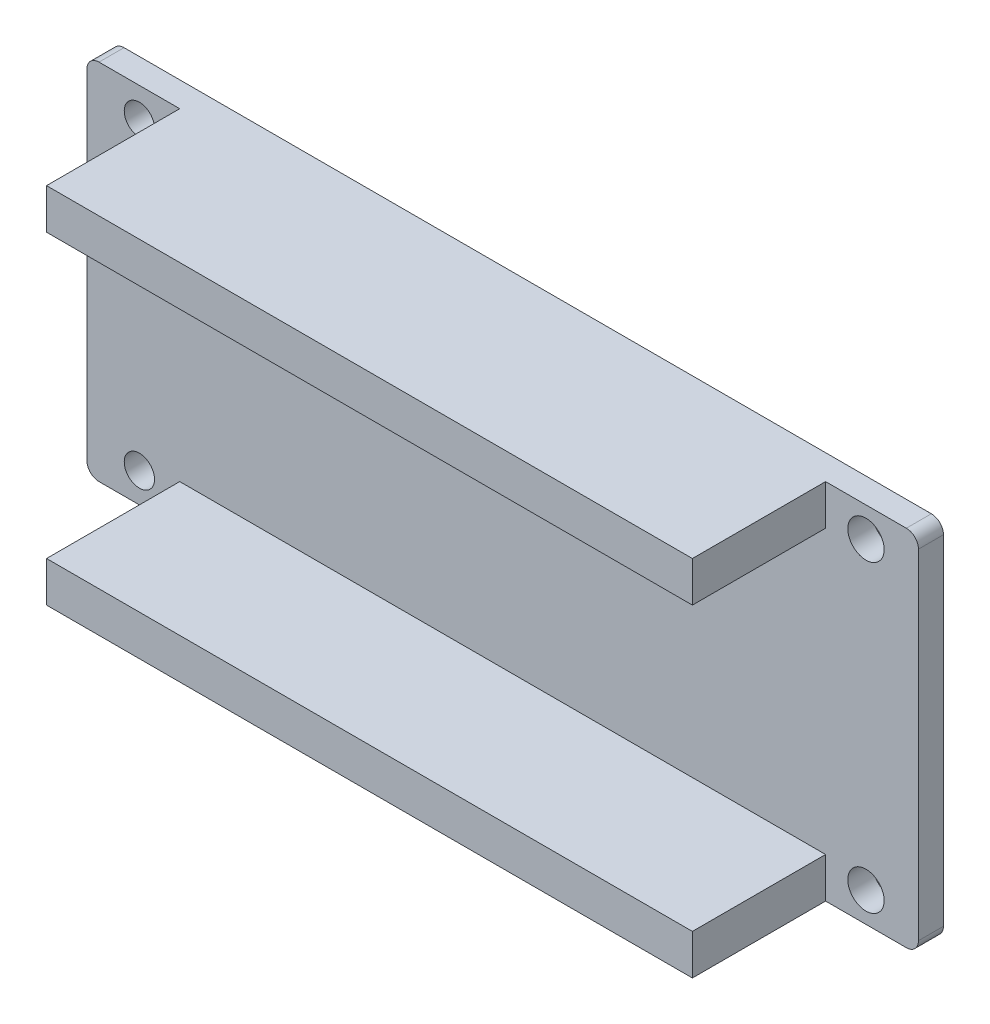
ISO-10303-21;
HEADER;
FILE_DESCRIPTION(('STEP AP214'),'2;1');
FILE_NAME('part.step','',(''),(''),'','','');
FILE_SCHEMA(('AUTOMOTIVE_DESIGN { 1 0 10303 214 1 1 1 1 }'));
ENDSEC;
DATA;
#1=APPLICATION_CONTEXT('core data for automotive mechanical design processes');
#2=APPLICATION_PROTOCOL_DEFINITION('international standard','automotive_design',2000,#1);
#3=PRODUCT_CONTEXT('',#1,'mechanical');
#4=PRODUCT('Part','Part','',(#3));
#5=PRODUCT_RELATED_PRODUCT_CATEGORY('part','',(#4));
#6=PRODUCT_DEFINITION_FORMATION('','',#4);
#7=PRODUCT_DEFINITION_CONTEXT('part definition',#1,'design');
#8=PRODUCT_DEFINITION('design','',#6,#7);
#9=PRODUCT_DEFINITION_SHAPE('','',#8);
#10=(LENGTH_UNIT() NAMED_UNIT(*) SI_UNIT(.MILLI.,.METRE.));
#11=(NAMED_UNIT(*) PLANE_ANGLE_UNIT() SI_UNIT($,.RADIAN.));
#12=(NAMED_UNIT(*) SI_UNIT($,.STERADIAN.) SOLID_ANGLE_UNIT());
#13=UNCERTAINTY_MEASURE_WITH_UNIT(LENGTH_MEASURE(1.E-05),#10,'distance_accuracy_value','');
#14=(GEOMETRIC_REPRESENTATION_CONTEXT(3) GLOBAL_UNCERTAINTY_ASSIGNED_CONTEXT((#13)) GLOBAL_UNIT_ASSIGNED_CONTEXT((#10,
#11,#12)) REPRESENTATION_CONTEXT('',''));
#15=CARTESIAN_POINT('',(0.,0.,0.));
#16=DIRECTION('',(0.,0.,1.));
#17=DIRECTION('',(1.,0.,0.));
#18=AXIS2_PLACEMENT_3D('',#15,#16,#17);
#19=CARTESIAN_POINT('',(0.,0.,1.5748));
#20=DIRECTION('',(0.,0.,-1.));
#21=DIRECTION('',(-1.,0.,0.));
#22=AXIS2_PLACEMENT_3D('',#19,#20,#21);
#23=PLANE('',#22);
#24=CARTESIAN_POINT('',(49.022,1.86689999999999,1.5748));
#25=DIRECTION('',(0.,0.,-1.));
#26=DIRECTION('',(-1.,0.,0.));
#27=AXIS2_PLACEMENT_3D('',#24,#25,#26);
#28=CIRCLE('',#27,1.143);
#29=CARTESIAN_POINT('',(47.879,1.86689999999999,1.5748));
#30=VERTEX_POINT('',#29);
#31=EDGE_CURVE('E470',#30,#30,#28,.F.);
#32=ORIENTED_EDGE('',*,*,#31,.F.);
#33=EDGE_LOOP('',(#32));
#34=FACE_BOUND('',#33,.T.);
#35=CARTESIAN_POINT('',(3.30200000000001,1.86689999999999,1.5748));
#36=DIRECTION('',(0.,0.,-1.));
#37=DIRECTION('',(-1.,0.,0.));
#38=AXIS2_PLACEMENT_3D('',#35,#36,#37);
#39=CIRCLE('',#38,0.9525);
#40=CARTESIAN_POINT('',(2.34950000000001,1.86689999999999,1.5748));
#41=VERTEX_POINT('',#40);
#42=EDGE_CURVE('E464',#41,#41,#39,.F.);
#43=ORIENTED_EDGE('',*,*,#42,.F.);
#44=EDGE_LOOP('',(#43));
#45=FACE_BOUND('',#44,.T.);
#46=CARTESIAN_POINT('',(3.30200000000001,20.9931,1.5748));
#47=DIRECTION('',(0.,0.,-1.));
#48=DIRECTION('',(-1.,0.,0.));
#49=AXIS2_PLACEMENT_3D('',#46,#47,#48);
#50=CIRCLE('',#49,0.9525);
#51=CARTESIAN_POINT('',(2.34950000000001,20.9931,1.5748));
#52=VERTEX_POINT('',#51);
#53=EDGE_CURVE('E452',#52,#52,#50,.F.);
#54=ORIENTED_EDGE('',*,*,#53,.F.);
#55=EDGE_LOOP('',(#54));
#56=FACE_BOUND('',#55,.T.);
#57=CARTESIAN_POINT('',(49.022,20.9931,1.5748));
#58=DIRECTION('',(0.,0.,-1.));
#59=DIRECTION('',(-1.,0.,0.));
#60=AXIS2_PLACEMENT_3D('',#57,#58,#59);
#61=CIRCLE('',#60,1.143);
#62=CARTESIAN_POINT('',(47.879,20.9931,1.5748));
#63=VERTEX_POINT('',#62);
#64=EDGE_CURVE('E207',#63,#63,#61,.F.);
#65=ORIENTED_EDGE('',*,*,#64,.F.);
#66=EDGE_LOOP('',(#65));
#67=FACE_BOUND('',#66,.T.);
#68=DIRECTION('',(0.,-1.,0.));
#69=VECTOR('',#68,1.);
#70=CARTESIAN_POINT('',(0.,0.,1.5748));
#71=LINE('',#70,#69);
#72=CARTESIAN_POINT('',(0.,22.098,1.5748));
#73=VERTEX_POINT('',#72);
#74=CARTESIAN_POINT('',(0.,0.762,1.5748));
#75=VERTEX_POINT('',#74);
#76=EDGE_CURVE('E187',#73,#75,#71,.T.);
#77=ORIENTED_EDGE('',*,*,#76,.T.);
#78=CARTESIAN_POINT('',(0.762,0.762,1.5748));
#79=DIRECTION('',(0.,0.,-1.));
#80=DIRECTION('',(-1.,0.,0.));
#81=AXIS2_PLACEMENT_3D('',#78,#79,#80);
#82=CIRCLE('',#81,0.762);
#83=CARTESIAN_POINT('',(0.762,0.,1.5748));
#84=VERTEX_POINT('',#83);
#85=EDGE_CURVE('E325',#75,#84,#82,.F.);
#86=ORIENTED_EDGE('',*,*,#85,.T.);
#87=DIRECTION('',(1.,0.,0.));
#88=VECTOR('',#87,1.);
#89=CARTESIAN_POINT('',(0.,0.,1.5748));
#90=LINE('',#89,#88);
#91=CARTESIAN_POINT('',(5.842,0.,1.5748));
#92=VERTEX_POINT('',#91);
#93=EDGE_CURVE('E186',#84,#92,#90,.T.);
#94=ORIENTED_EDGE('',*,*,#93,.T.);
#95=DIRECTION('',(0.,-1.,0.));
#96=VECTOR('',#95,1.);
#97=CARTESIAN_POINT('',(5.842,0.,1.5748));
#98=LINE('',#97,#96);
#99=CARTESIAN_POINT('',(5.842,2.54,1.5748));
#100=VERTEX_POINT('',#99);
#101=EDGE_CURVE('E197',#100,#92,#98,.T.);
#102=ORIENTED_EDGE('',*,*,#101,.F.);
#103=DIRECTION('',(-1.,0.,0.));
#104=VECTOR('',#103,1.);
#105=CARTESIAN_POINT('',(5.842,2.54,1.5748));
#106=LINE('',#105,#104);
#107=CARTESIAN_POINT('',(46.482,2.54,1.5748));
#108=VERTEX_POINT('',#107);
#109=EDGE_CURVE('E193',#108,#100,#106,.T.);
#110=ORIENTED_EDGE('',*,*,#109,.F.);
#111=DIRECTION('',(0.,1.,0.));
#112=VECTOR('',#111,1.);
#113=CARTESIAN_POINT('',(46.482,0.,1.5748));
#114=LINE('',#113,#112);
#115=CARTESIAN_POINT('',(46.482,0.,1.5748));
#116=VERTEX_POINT('',#115);
#117=EDGE_CURVE('E190',#116,#108,#114,.T.);
#118=ORIENTED_EDGE('',*,*,#117,.F.);
#119=CARTESIAN_POINT('',(51.562,0.,1.5748));
#120=VERTEX_POINT('',#119);
#121=EDGE_CURVE('E175',#116,#120,#90,.T.);
#122=ORIENTED_EDGE('',*,*,#121,.T.);
#123=CARTESIAN_POINT('',(51.562,0.762,1.5748));
#124=DIRECTION('',(0.,0.,-1.));
#125=DIRECTION('',(-1.,0.,0.));
#126=AXIS2_PLACEMENT_3D('',#123,#124,#125);
#127=CIRCLE('',#126,0.762);
#128=CARTESIAN_POINT('',(52.324,0.762,1.5748));
#129=VERTEX_POINT('',#128);
#130=EDGE_CURVE('E323',#120,#129,#127,.F.);
#131=ORIENTED_EDGE('',*,*,#130,.T.);
#132=DIRECTION('',(0.,1.,0.));
#133=VECTOR('',#132,1.);
#134=CARTESIAN_POINT('',(52.324,0.,1.5748));
#135=LINE('',#134,#133);
#136=CARTESIAN_POINT('',(52.324,22.098,1.5748));
#137=VERTEX_POINT('',#136);
#138=EDGE_CURVE('E290',#129,#137,#135,.T.);
#139=ORIENTED_EDGE('',*,*,#138,.T.);
#140=CARTESIAN_POINT('',(51.562,22.098,1.5748));
#141=DIRECTION('',(0.,0.,-1.));
#142=DIRECTION('',(-1.,0.,0.));
#143=AXIS2_PLACEMENT_3D('',#140,#141,#142);
#144=CIRCLE('',#143,0.762);
#145=CARTESIAN_POINT('',(51.562,22.86,1.5748));
#146=VERTEX_POINT('',#145);
#147=EDGE_CURVE('E58',#137,#146,#144,.F.);
#148=ORIENTED_EDGE('',*,*,#147,.T.);
#149=DIRECTION('',(-1.,0.,0.));
#150=VECTOR('',#149,1.);
#151=CARTESIAN_POINT('',(0.,22.86,1.5748));
#152=LINE('',#151,#150);
#153=CARTESIAN_POINT('',(46.482,22.86,1.5748));
#154=VERTEX_POINT('',#153);
#155=EDGE_CURVE('E293',#146,#154,#152,.T.);
#156=ORIENTED_EDGE('',*,*,#155,.T.);
#157=DIRECTION('',(0.,1.,0.));
#158=VECTOR('',#157,1.);
#159=CARTESIAN_POINT('',(46.482,22.86,1.5748));
#160=LINE('',#159,#158);
#161=CARTESIAN_POINT('',(46.482,20.32,1.5748));
#162=VERTEX_POINT('',#161);
#163=EDGE_CURVE('E229',#162,#154,#160,.T.);
#164=ORIENTED_EDGE('',*,*,#163,.F.);
#165=DIRECTION('',(1.,0.,0.));
#166=VECTOR('',#165,1.);
#167=CARTESIAN_POINT('',(5.842,20.32,1.5748));
#168=LINE('',#167,#166);
#169=CARTESIAN_POINT('',(5.842,20.32,1.5748));
#170=VERTEX_POINT('',#169);
#171=EDGE_CURVE('E238',#170,#162,#168,.T.);
#172=ORIENTED_EDGE('',*,*,#171,.F.);
#173=DIRECTION('',(0.,-1.,0.));
#174=VECTOR('',#173,1.);
#175=CARTESIAN_POINT('',(5.842,22.86,1.5748));
#176=LINE('',#175,#174);
#177=CARTESIAN_POINT('',(5.842,22.86,1.5748));
#178=VERTEX_POINT('',#177);
#179=EDGE_CURVE('E218',#178,#170,#176,.T.);
#180=ORIENTED_EDGE('',*,*,#179,.F.);
#181=CARTESIAN_POINT('',(0.762,22.86,1.5748));
#182=VERTEX_POINT('',#181);
#183=EDGE_CURVE('E292',#178,#182,#152,.T.);
#184=ORIENTED_EDGE('',*,*,#183,.T.);
#185=CARTESIAN_POINT('',(0.762,22.098,1.5748));
#186=DIRECTION('',(0.,0.,-1.));
#187=DIRECTION('',(-1.,0.,0.));
#188=AXIS2_PLACEMENT_3D('',#185,#186,#187);
#189=CIRCLE('',#188,0.762);
#190=EDGE_CURVE('E320',#182,#73,#189,.F.);
#191=ORIENTED_EDGE('',*,*,#190,.T.);
#192=EDGE_LOOP('',(#77,#86,#94,#102,#110,#118,#122,#131,#139,#148,#156,#164,#172,#180,#184,#191));
#193=FACE_BOUND('',#192,.T.);
#194=ADVANCED_FACE('F36',(#34,#45,#56,#67,#193),#23,.F.);
#195=CARTESIAN_POINT('',(0.,0.,1.5748));
#196=DIRECTION('',(1.,0.,0.));
#197=DIRECTION('',(0.,0.,-1.));
#198=AXIS2_PLACEMENT_3D('',#195,#196,#197);
#199=PLANE('',#198);
#200=DIRECTION('',(0.,-1.,0.));
#201=VECTOR('',#200,1.);
#202=CARTESIAN_POINT('',(0.,0.,0.));
#203=LINE('',#202,#201);
#204=CARTESIAN_POINT('',(0.,22.098,0.));
#205=VERTEX_POINT('',#204);
#206=CARTESIAN_POINT('',(0.,0.762,0.));
#207=VERTEX_POINT('',#206);
#208=EDGE_CURVE('E287',#205,#207,#203,.T.);
#209=ORIENTED_EDGE('',*,*,#208,.T.);
#210=DIRECTION('',(0.,0.,-1.));
#211=VECTOR('',#210,1.);
#212=CARTESIAN_POINT('',(0.,0.762,1.5748));
#213=LINE('',#212,#211);
#214=EDGE_CURVE('E318',#207,#75,#213,.F.);
#215=ORIENTED_EDGE('',*,*,#214,.T.);
#216=ORIENTED_EDGE('',*,*,#76,.F.);
#217=DIRECTION('',(0.,0.,-1.));
#218=VECTOR('',#217,1.);
#219=CARTESIAN_POINT('',(0.,22.098,1.5748));
#220=LINE('',#219,#218);
#221=EDGE_CURVE('E315',#73,#205,#220,.T.);
#222=ORIENTED_EDGE('',*,*,#221,.T.);
#223=EDGE_LOOP('',(#209,#215,#216,#222));
#224=FACE_BOUND('',#223,.T.);
#225=ADVANCED_FACE('F374',(#224),#199,.F.);
#226=CARTESIAN_POINT('',(0.,0.,1.5748));
#227=DIRECTION('',(0.,1.,0.));
#228=DIRECTION('',(0.,0.,1.));
#229=AXIS2_PLACEMENT_3D('',#226,#227,#228);
#230=PLANE('',#229);
#231=ORIENTED_EDGE('',*,*,#93,.F.);
#232=DIRECTION('',(0.,0.,-1.));
#233=VECTOR('',#232,1.);
#234=CARTESIAN_POINT('',(0.762,0.,1.5748));
#235=LINE('',#234,#233);
#236=CARTESIAN_POINT('',(0.762,0.,0.));
#237=VERTEX_POINT('',#236);
#238=EDGE_CURVE('E304',#84,#237,#235,.T.);
#239=ORIENTED_EDGE('',*,*,#238,.T.);
#240=DIRECTION('',(1.,0.,0.));
#241=VECTOR('',#240,1.);
#242=CARTESIAN_POINT('',(0.,0.,0.));
#243=LINE('',#242,#241);
#244=CARTESIAN_POINT('',(51.562,0.,0.));
#245=VERTEX_POINT('',#244);
#246=EDGE_CURVE('E297',#237,#245,#243,.T.);
#247=ORIENTED_EDGE('',*,*,#246,.T.);
#248=DIRECTION('',(0.,0.,-1.));
#249=VECTOR('',#248,1.);
#250=CARTESIAN_POINT('',(51.562,0.,1.5748));
#251=LINE('',#250,#249);
#252=EDGE_CURVE('E184',#245,#120,#251,.F.);
#253=ORIENTED_EDGE('',*,*,#252,.T.);
#254=ORIENTED_EDGE('',*,*,#121,.F.);
#255=DIRECTION('',(0.,0.,-1.));
#256=VECTOR('',#255,1.);
#257=CARTESIAN_POINT('',(46.482,0.,9.9568));
#258=LINE('',#257,#256);
#259=CARTESIAN_POINT('',(46.482,0.,9.9568));
#260=VERTEX_POINT('',#259);
#261=EDGE_CURVE('E180',#260,#116,#258,.T.);
#262=ORIENTED_EDGE('',*,*,#261,.F.);
#263=DIRECTION('',(1.,0.,0.));
#264=VECTOR('',#263,1.);
#265=CARTESIAN_POINT('',(5.842,0.,9.9568));
#266=LINE('',#265,#264);
#267=CARTESIAN_POINT('',(5.842,0.,9.9568));
#268=VERTEX_POINT('',#267);
#269=EDGE_CURVE('E221',#268,#260,#266,.T.);
#270=ORIENTED_EDGE('',*,*,#269,.F.);
#271=DIRECTION('',(0.,0.,-1.));
#272=VECTOR('',#271,1.);
#273=CARTESIAN_POINT('',(5.842,0.,9.9568));
#274=LINE('',#273,#272);
#275=EDGE_CURVE('E202',#268,#92,#274,.T.);
#276=ORIENTED_EDGE('',*,*,#275,.T.);
#277=EDGE_LOOP('',(#231,#239,#247,#253,#254,#262,#270,#276));
#278=FACE_BOUND('',#277,.T.);
#279=ADVANCED_FACE('F178',(#278),#230,.F.);
#280=CARTESIAN_POINT('',(52.324,0.,1.5748));
#281=DIRECTION('',(-1.,0.,0.));
#282=DIRECTION('',(0.,0.,1.));
#283=AXIS2_PLACEMENT_3D('',#280,#281,#282);
#284=PLANE('',#283);
#285=ORIENTED_EDGE('',*,*,#138,.F.);
#286=DIRECTION('',(0.,0.,-1.));
#287=VECTOR('',#286,1.);
#288=CARTESIAN_POINT('',(52.324,0.762,1.5748));
#289=LINE('',#288,#287);
#290=CARTESIAN_POINT('',(52.324,0.762,0.));
#291=VERTEX_POINT('',#290);
#292=EDGE_CURVE('E329',#129,#291,#289,.T.);
#293=ORIENTED_EDGE('',*,*,#292,.T.);
#294=DIRECTION('',(0.,1.,0.));
#295=VECTOR('',#294,1.);
#296=CARTESIAN_POINT('',(52.324,0.,0.));
#297=LINE('',#296,#295);
#298=CARTESIAN_POINT('',(52.324,22.098,0.));
#299=VERTEX_POINT('',#298);
#300=EDGE_CURVE('E299',#291,#299,#297,.T.);
#301=ORIENTED_EDGE('',*,*,#300,.T.);
#302=DIRECTION('',(0.,0.,-1.));
#303=VECTOR('',#302,1.);
#304=CARTESIAN_POINT('',(52.324,22.098,1.5748));
#305=LINE('',#304,#303);
#306=EDGE_CURVE('E327',#299,#137,#305,.F.);
#307=ORIENTED_EDGE('',*,*,#306,.T.);
#308=EDGE_LOOP('',(#285,#293,#301,#307));
#309=FACE_BOUND('',#308,.T.);
#310=ADVANCED_FACE('F335',(#309),#284,.F.);
#311=CARTESIAN_POINT('',(0.,22.86,1.5748));
#312=DIRECTION('',(0.,-1.,0.));
#313=DIRECTION('',(0.,0.,-1.));
#314=AXIS2_PLACEMENT_3D('',#311,#312,#313);
#315=PLANE('',#314);
#316=ORIENTED_EDGE('',*,*,#155,.F.);
#317=DIRECTION('',(0.,0.,-1.));
#318=VECTOR('',#317,1.);
#319=CARTESIAN_POINT('',(51.562,22.86,1.5748));
#320=LINE('',#319,#318);
#321=CARTESIAN_POINT('',(51.562,22.86,0.));
#322=VERTEX_POINT('',#321);
#323=EDGE_CURVE('E11',#146,#322,#320,.T.);
#324=ORIENTED_EDGE('',*,*,#323,.T.);
#325=DIRECTION('',(-1.,0.,0.));
#326=VECTOR('',#325,1.);
#327=CARTESIAN_POINT('',(0.,22.86,0.));
#328=LINE('',#327,#326);
#329=CARTESIAN_POINT('',(0.762,22.86,0.));
#330=VERTEX_POINT('',#329);
#331=EDGE_CURVE('E288',#322,#330,#328,.T.);
#332=ORIENTED_EDGE('',*,*,#331,.T.);
#333=DIRECTION('',(0.,0.,-1.));
#334=VECTOR('',#333,1.);
#335=CARTESIAN_POINT('',(0.762,22.86,1.5748));
#336=LINE('',#335,#334);
#337=EDGE_CURVE('E44',#330,#182,#336,.F.);
#338=ORIENTED_EDGE('',*,*,#337,.T.);
#339=ORIENTED_EDGE('',*,*,#183,.F.);
#340=DIRECTION('',(0.,0.,-1.));
#341=VECTOR('',#340,1.);
#342=CARTESIAN_POINT('',(5.842,22.86,9.9568));
#343=LINE('',#342,#341);
#344=CARTESIAN_POINT('',(5.842,22.86,9.9568));
#345=VERTEX_POINT('',#344);
#346=EDGE_CURVE('E235',#345,#178,#343,.T.);
#347=ORIENTED_EDGE('',*,*,#346,.F.);
#348=DIRECTION('',(-1.,0.,0.));
#349=VECTOR('',#348,1.);
#350=CARTESIAN_POINT('',(5.842,22.86,9.9568));
#351=LINE('',#350,#349);
#352=CARTESIAN_POINT('',(46.482,22.86,9.9568));
#353=VERTEX_POINT('',#352);
#354=EDGE_CURVE('E233',#353,#345,#351,.T.);
#355=ORIENTED_EDGE('',*,*,#354,.F.);
#356=DIRECTION('',(0.,0.,-1.));
#357=VECTOR('',#356,1.);
#358=CARTESIAN_POINT('',(46.482,22.86,9.9568));
#359=LINE('',#358,#357);
#360=EDGE_CURVE('E245',#353,#154,#359,.T.);
#361=ORIENTED_EDGE('',*,*,#360,.T.);
#362=EDGE_LOOP('',(#316,#324,#332,#338,#339,#347,#355,#361));
#363=FACE_BOUND('',#362,.T.);
#364=ADVANCED_FACE('F345',(#363),#315,.F.);
#365=CARTESIAN_POINT('',(0.,0.,0.));
#366=DIRECTION('',(0.,0.,-1.));
#367=DIRECTION('',(-1.,0.,0.));
#368=AXIS2_PLACEMENT_3D('',#365,#366,#367);
#369=PLANE('',#368);
#370=CARTESIAN_POINT('',(49.022,1.86689999999999,0.));
#371=DIRECTION('',(0.,0.,-1.));
#372=DIRECTION('',(1.,0.,0.));
#373=AXIS2_PLACEMENT_3D('',#370,#371,#372);
#374=CIRCLE('',#373,1.143);
#375=CARTESIAN_POINT('',(50.165,1.86689999999999,0.));
#376=VERTEX_POINT('',#375);
#377=EDGE_CURVE('E467',#376,#376,#374,.T.);
#378=ORIENTED_EDGE('',*,*,#377,.F.);
#379=EDGE_LOOP('',(#378));
#380=FACE_BOUND('',#379,.T.);
#381=CARTESIAN_POINT('',(3.30200000000001,1.86689999999999,0.));
#382=DIRECTION('',(0.,0.,-1.));
#383=DIRECTION('',(1.,0.,0.));
#384=AXIS2_PLACEMENT_3D('',#381,#382,#383);
#385=CIRCLE('',#384,0.9525);
#386=CARTESIAN_POINT('',(4.25450000000001,1.86689999999999,0.));
#387=VERTEX_POINT('',#386);
#388=EDGE_CURVE('E461',#387,#387,#385,.T.);
#389=ORIENTED_EDGE('',*,*,#388,.F.);
#390=EDGE_LOOP('',(#389));
#391=FACE_BOUND('',#390,.T.);
#392=CARTESIAN_POINT('',(3.30200000000001,20.9931,0.));
#393=DIRECTION('',(0.,0.,-1.));
#394=DIRECTION('',(-1.,0.,0.));
#395=AXIS2_PLACEMENT_3D('',#392,#393,#394);
#396=CIRCLE('',#395,0.9525);
#397=CARTESIAN_POINT('',(2.34950000000001,20.9931,0.));
#398=VERTEX_POINT('',#397);
#399=EDGE_CURVE('E455',#398,#398,#396,.T.);
#400=ORIENTED_EDGE('',*,*,#399,.F.);
#401=EDGE_LOOP('',(#400));
#402=FACE_BOUND('',#401,.T.);
#403=CARTESIAN_POINT('',(49.022,20.9931,0.));
#404=DIRECTION('',(0.,0.,-1.));
#405=DIRECTION('',(-1.,0.,0.));
#406=AXIS2_PLACEMENT_3D('',#403,#404,#405);
#407=CIRCLE('',#406,1.143);
#408=CARTESIAN_POINT('',(47.879,20.9931,0.));
#409=VERTEX_POINT('',#408);
#410=EDGE_CURVE('E457',#409,#409,#407,.T.);
#411=ORIENTED_EDGE('',*,*,#410,.F.);
#412=EDGE_LOOP('',(#411));
#413=FACE_BOUND('',#412,.T.);
#414=DIRECTION('',(0.,1.,0.));
#415=VECTOR('',#414,1.);
#416=CARTESIAN_POINT('',(12.7,2.54,0.));
#417=LINE('',#416,#415);
#418=CARTESIAN_POINT('',(12.7,2.54,0.));
#419=VERTEX_POINT('',#418);
#420=CARTESIAN_POINT('',(12.7,20.32,0.));
#421=VERTEX_POINT('',#420);
#422=EDGE_CURVE('E254',#419,#421,#417,.T.);
#423=ORIENTED_EDGE('',*,*,#422,.F.);
#424=DIRECTION('',(-1.,0.,0.));
#425=VECTOR('',#424,1.);
#426=CARTESIAN_POINT('',(43.688,2.54,0.));
#427=LINE('',#426,#425);
#428=CARTESIAN_POINT('',(43.688,2.54,0.));
#429=VERTEX_POINT('',#428);
#430=EDGE_CURVE('E259',#429,#419,#427,.T.);
#431=ORIENTED_EDGE('',*,*,#430,.F.);
#432=DIRECTION('',(0.,-1.,0.));
#433=VECTOR('',#432,1.);
#434=CARTESIAN_POINT('',(43.688,2.54,0.));
#435=LINE('',#434,#433);
#436=CARTESIAN_POINT('',(43.688,20.32,0.));
#437=VERTEX_POINT('',#436);
#438=EDGE_CURVE('E271',#437,#429,#435,.T.);
#439=ORIENTED_EDGE('',*,*,#438,.F.);
#440=DIRECTION('',(1.,0.,0.));
#441=VECTOR('',#440,1.);
#442=CARTESIAN_POINT('',(43.688,20.32,0.));
#443=LINE('',#442,#441);
#444=EDGE_CURVE('E268',#421,#437,#443,.T.);
#445=ORIENTED_EDGE('',*,*,#444,.F.);
#446=EDGE_LOOP('',(#423,#431,#439,#445));
#447=FACE_BOUND('',#446,.T.);
#448=ORIENTED_EDGE('',*,*,#246,.F.);
#449=CARTESIAN_POINT('',(0.762,0.762,0.));
#450=DIRECTION('',(0.,0.,-1.));
#451=DIRECTION('',(-1.,0.,0.));
#452=AXIS2_PLACEMENT_3D('',#449,#450,#451);
#453=CIRCLE('',#452,0.762);
#454=EDGE_CURVE('E313',#237,#207,#453,.T.);
#455=ORIENTED_EDGE('',*,*,#454,.T.);
#456=ORIENTED_EDGE('',*,*,#208,.F.);
#457=CARTESIAN_POINT('',(0.762,22.098,0.));
#458=DIRECTION('',(0.,0.,-1.));
#459=DIRECTION('',(-1.,0.,0.));
#460=AXIS2_PLACEMENT_3D('',#457,#458,#459);
#461=CIRCLE('',#460,0.762);
#462=EDGE_CURVE('E307',#205,#330,#461,.T.);
#463=ORIENTED_EDGE('',*,*,#462,.T.);
#464=ORIENTED_EDGE('',*,*,#331,.F.);
#465=CARTESIAN_POINT('',(51.562,22.098,0.));
#466=DIRECTION('',(0.,0.,-1.));
#467=DIRECTION('',(-1.,0.,0.));
#468=AXIS2_PLACEMENT_3D('',#465,#466,#467);
#469=CIRCLE('',#468,0.762);
#470=EDGE_CURVE('E309',#322,#299,#469,.T.);
#471=ORIENTED_EDGE('',*,*,#470,.T.);
#472=ORIENTED_EDGE('',*,*,#300,.F.);
#473=CARTESIAN_POINT('',(51.562,0.762,0.));
#474=DIRECTION('',(0.,0.,-1.));
#475=DIRECTION('',(-1.,0.,0.));
#476=AXIS2_PLACEMENT_3D('',#473,#474,#475);
#477=CIRCLE('',#476,0.762);
#478=EDGE_CURVE('E311',#291,#245,#477,.T.);
#479=ORIENTED_EDGE('',*,*,#478,.T.);
#480=EDGE_LOOP('',(#448,#455,#456,#463,#464,#471,#472,#479));
#481=FACE_BOUND('',#480,.T.);
#482=ADVANCED_FACE('F340',(#380,#391,#402,#413,#447,#481),#369,.T.);
#483=CARTESIAN_POINT('',(12.7,2.54,-2.032));
#484=DIRECTION('',(1.,0.,0.));
#485=DIRECTION('',(0.,0.,-1.));
#486=AXIS2_PLACEMENT_3D('',#483,#484,#485);
#487=PLANE('',#486);
#488=ORIENTED_EDGE('',*,*,#422,.T.);
#489=DIRECTION('',(0.,0.,1.));
#490=VECTOR('',#489,1.);
#491=CARTESIAN_POINT('',(12.7,20.32,-2.032));
#492=LINE('',#491,#490);
#493=CARTESIAN_POINT('',(12.7,20.32,-2.032));
#494=VERTEX_POINT('',#493);
#495=EDGE_CURVE('E284',#494,#421,#492,.T.);
#496=ORIENTED_EDGE('',*,*,#495,.F.);
#497=DIRECTION('',(0.,1.,0.));
#498=VECTOR('',#497,1.);
#499=CARTESIAN_POINT('',(12.7,2.54,-2.032));
#500=LINE('',#499,#498);
#501=CARTESIAN_POINT('',(12.7,2.54,-2.032));
#502=VERTEX_POINT('',#501);
#503=EDGE_CURVE('E255',#502,#494,#500,.T.);
#504=ORIENTED_EDGE('',*,*,#503,.F.);
#505=DIRECTION('',(0.,0.,1.));
#506=VECTOR('',#505,1.);
#507=CARTESIAN_POINT('',(12.7,2.54,-2.032));
#508=LINE('',#507,#506);
#509=EDGE_CURVE('E265',#502,#419,#508,.T.);
#510=ORIENTED_EDGE('',*,*,#509,.T.);
#511=EDGE_LOOP('',(#488,#496,#504,#510));
#512=FACE_BOUND('',#511,.T.);
#513=ADVANCED_FACE('F388',(#512),#487,.F.);
#514=CARTESIAN_POINT('',(43.688,20.32,-2.032));
#515=DIRECTION('',(0.,-1.,0.));
#516=DIRECTION('',(0.,0.,-1.));
#517=AXIS2_PLACEMENT_3D('',#514,#515,#516);
#518=PLANE('',#517);
#519=ORIENTED_EDGE('',*,*,#444,.T.);
#520=DIRECTION('',(0.,0.,1.));
#521=VECTOR('',#520,1.);
#522=CARTESIAN_POINT('',(43.688,20.32,-2.032));
#523=LINE('',#522,#521);
#524=CARTESIAN_POINT('',(43.688,20.32,-2.032));
#525=VERTEX_POINT('',#524);
#526=EDGE_CURVE('E281',#525,#437,#523,.T.);
#527=ORIENTED_EDGE('',*,*,#526,.F.);
#528=DIRECTION('',(1.,0.,0.));
#529=VECTOR('',#528,1.);
#530=CARTESIAN_POINT('',(43.688,20.32,-2.032));
#531=LINE('',#530,#529);
#532=EDGE_CURVE('E258',#494,#525,#531,.T.);
#533=ORIENTED_EDGE('',*,*,#532,.F.);
#534=ORIENTED_EDGE('',*,*,#495,.T.);
#535=EDGE_LOOP('',(#519,#527,#533,#534));
#536=FACE_BOUND('',#535,.T.);
#537=ADVANCED_FACE('F496',(#536),#518,.F.);
#538=CARTESIAN_POINT('',(43.688,2.54,-2.032));
#539=DIRECTION('',(-1.,0.,0.));
#540=DIRECTION('',(0.,0.,1.));
#541=AXIS2_PLACEMENT_3D('',#538,#539,#540);
#542=PLANE('',#541);
#543=ORIENTED_EDGE('',*,*,#438,.T.);
#544=DIRECTION('',(0.,0.,1.));
#545=VECTOR('',#544,1.);
#546=CARTESIAN_POINT('',(43.688,2.54,-2.032));
#547=LINE('',#546,#545);
#548=CARTESIAN_POINT('',(43.688,2.54,-2.032));
#549=VERTEX_POINT('',#548);
#550=EDGE_CURVE('E278',#549,#429,#547,.T.);
#551=ORIENTED_EDGE('',*,*,#550,.F.);
#552=DIRECTION('',(0.,-1.,0.));
#553=VECTOR('',#552,1.);
#554=CARTESIAN_POINT('',(43.688,2.54,-2.032));
#555=LINE('',#554,#553);
#556=EDGE_CURVE('E261',#525,#549,#555,.T.);
#557=ORIENTED_EDGE('',*,*,#556,.F.);
#558=ORIENTED_EDGE('',*,*,#526,.T.);
#559=EDGE_LOOP('',(#543,#551,#557,#558));
#560=FACE_BOUND('',#559,.T.);
#561=ADVANCED_FACE('F494',(#560),#542,.F.);
#562=CARTESIAN_POINT('',(43.688,2.54,-2.032));
#563=DIRECTION('',(0.,1.,0.));
#564=DIRECTION('',(0.,0.,1.));
#565=AXIS2_PLACEMENT_3D('',#562,#563,#564);
#566=PLANE('',#565);
#567=ORIENTED_EDGE('',*,*,#430,.T.);
#568=ORIENTED_EDGE('',*,*,#509,.F.);
#569=DIRECTION('',(-1.,0.,0.));
#570=VECTOR('',#569,1.);
#571=CARTESIAN_POINT('',(43.688,2.54,-2.032));
#572=LINE('',#571,#570);
#573=EDGE_CURVE('E263',#549,#502,#572,.T.);
#574=ORIENTED_EDGE('',*,*,#573,.F.);
#575=ORIENTED_EDGE('',*,*,#550,.T.);
#576=EDGE_LOOP('',(#567,#568,#574,#575));
#577=FACE_BOUND('',#576,.T.);
#578=ADVANCED_FACE('F485',(#577),#566,.F.);
#579=CARTESIAN_POINT('',(0.,0.,-2.032));
#580=DIRECTION('',(0.,0.,1.));
#581=DIRECTION('',(1.,0.,0.));
#582=AXIS2_PLACEMENT_3D('',#579,#580,#581);
#583=PLANE('',#582);
#584=ORIENTED_EDGE('',*,*,#503,.T.);
#585=ORIENTED_EDGE('',*,*,#532,.T.);
#586=ORIENTED_EDGE('',*,*,#556,.T.);
#587=ORIENTED_EDGE('',*,*,#573,.T.);
#588=EDGE_LOOP('',(#584,#585,#586,#587));
#589=FACE_BOUND('',#588,.T.);
#590=ADVANCED_FACE('F490',(#589),#583,.F.);
#591=CARTESIAN_POINT('',(5.842,22.86,9.9568));
#592=DIRECTION('',(1.,0.,0.));
#593=DIRECTION('',(0.,0.,-1.));
#594=AXIS2_PLACEMENT_3D('',#591,#592,#593);
#595=PLANE('',#594);
#596=ORIENTED_EDGE('',*,*,#179,.T.);
#597=DIRECTION('',(0.,0.,-1.));
#598=VECTOR('',#597,1.);
#599=CARTESIAN_POINT('',(5.842,20.32,9.9568));
#600=LINE('',#599,#598);
#601=CARTESIAN_POINT('',(5.842,20.32,9.9568));
#602=VERTEX_POINT('',#601);
#603=EDGE_CURVE('E251',#602,#170,#600,.T.);
#604=ORIENTED_EDGE('',*,*,#603,.F.);
#605=DIRECTION('',(0.,-1.,0.));
#606=VECTOR('',#605,1.);
#607=CARTESIAN_POINT('',(5.842,22.86,9.9568));
#608=LINE('',#607,#606);
#609=EDGE_CURVE('E225',#345,#602,#608,.T.);
#610=ORIENTED_EDGE('',*,*,#609,.F.);
#611=ORIENTED_EDGE('',*,*,#346,.T.);
#612=EDGE_LOOP('',(#596,#604,#610,#611));
#613=FACE_BOUND('',#612,.T.);
#614=ADVANCED_FACE('F359',(#613),#595,.F.);
#615=CARTESIAN_POINT('',(5.842,20.32,9.9568));
#616=DIRECTION('',(0.,1.,0.));
#617=DIRECTION('',(0.,0.,1.));
#618=AXIS2_PLACEMENT_3D('',#615,#616,#617);
#619=PLANE('',#618);
#620=ORIENTED_EDGE('',*,*,#171,.T.);
#621=DIRECTION('',(0.,0.,-1.));
#622=VECTOR('',#621,1.);
#623=CARTESIAN_POINT('',(46.482,20.32,9.9568));
#624=LINE('',#623,#622);
#625=CARTESIAN_POINT('',(46.482,20.32,9.9568));
#626=VERTEX_POINT('',#625);
#627=EDGE_CURVE('E248',#626,#162,#624,.T.);
#628=ORIENTED_EDGE('',*,*,#627,.F.);
#629=DIRECTION('',(1.,0.,0.));
#630=VECTOR('',#629,1.);
#631=CARTESIAN_POINT('',(5.842,20.32,9.9568));
#632=LINE('',#631,#630);
#633=EDGE_CURVE('E228',#602,#626,#632,.T.);
#634=ORIENTED_EDGE('',*,*,#633,.F.);
#635=ORIENTED_EDGE('',*,*,#603,.T.);
#636=EDGE_LOOP('',(#620,#628,#634,#635));
#637=FACE_BOUND('',#636,.T.);
#638=ADVANCED_FACE('F353',(#637),#619,.F.);
#639=CARTESIAN_POINT('',(46.482,22.86,9.9568));
#640=DIRECTION('',(-1.,0.,0.));
#641=DIRECTION('',(0.,0.,1.));
#642=AXIS2_PLACEMENT_3D('',#639,#640,#641);
#643=PLANE('',#642);
#644=ORIENTED_EDGE('',*,*,#163,.T.);
#645=ORIENTED_EDGE('',*,*,#360,.F.);
#646=DIRECTION('',(0.,1.,0.));
#647=VECTOR('',#646,1.);
#648=CARTESIAN_POINT('',(46.482,22.86,9.9568));
#649=LINE('',#648,#647);
#650=EDGE_CURVE('E231',#626,#353,#649,.T.);
#651=ORIENTED_EDGE('',*,*,#650,.F.);
#652=ORIENTED_EDGE('',*,*,#627,.T.);
#653=EDGE_LOOP('',(#644,#645,#651,#652));
#654=FACE_BOUND('',#653,.T.);
#655=ADVANCED_FACE('F349',(#654),#643,.F.);
#656=CARTESIAN_POINT('',(0.,0.,9.9568));
#657=DIRECTION('',(0.,0.,1.));
#658=DIRECTION('',(1.,0.,0.));
#659=AXIS2_PLACEMENT_3D('',#656,#657,#658);
#660=PLANE('',#659);
#661=ORIENTED_EDGE('',*,*,#609,.T.);
#662=ORIENTED_EDGE('',*,*,#633,.T.);
#663=ORIENTED_EDGE('',*,*,#650,.T.);
#664=ORIENTED_EDGE('',*,*,#354,.T.);
#665=EDGE_LOOP('',(#661,#662,#663,#664));
#666=FACE_BOUND('',#665,.T.);
#667=ADVANCED_FACE('F361',(#666),#660,.T.);
#668=CARTESIAN_POINT('',(5.842,0.,9.9568));
#669=DIRECTION('',(1.,0.,0.));
#670=DIRECTION('',(0.,0.,-1.));
#671=AXIS2_PLACEMENT_3D('',#668,#669,#670);
#672=PLANE('',#671);
#673=ORIENTED_EDGE('',*,*,#101,.T.);
#674=ORIENTED_EDGE('',*,*,#275,.F.);
#675=DIRECTION('',(0.,-1.,0.));
#676=VECTOR('',#675,1.);
#677=CARTESIAN_POINT('',(5.842,0.,9.9568));
#678=LINE('',#677,#676);
#679=CARTESIAN_POINT('',(5.842,2.54,9.9568));
#680=VERTEX_POINT('',#679);
#681=EDGE_CURVE('E214',#680,#268,#678,.T.);
#682=ORIENTED_EDGE('',*,*,#681,.F.);
#683=DIRECTION('',(0.,0.,-1.));
#684=VECTOR('',#683,1.);
#685=CARTESIAN_POINT('',(5.842,2.54,9.9568));
#686=LINE('',#685,#684);
#687=EDGE_CURVE('E204',#680,#100,#686,.T.);
#688=ORIENTED_EDGE('',*,*,#687,.T.);
#689=EDGE_LOOP('',(#673,#674,#682,#688));
#690=FACE_BOUND('',#689,.T.);
#691=ADVANCED_FACE('F363',(#690),#672,.F.);
#692=CARTESIAN_POINT('',(46.482,0.,9.9568));
#693=DIRECTION('',(-1.,0.,0.));
#694=DIRECTION('',(0.,0.,1.));
#695=AXIS2_PLACEMENT_3D('',#692,#693,#694);
#696=PLANE('',#695);
#697=ORIENTED_EDGE('',*,*,#117,.T.);
#698=DIRECTION('',(0.,0.,-1.));
#699=VECTOR('',#698,1.);
#700=CARTESIAN_POINT('',(46.482,2.54,9.9568));
#701=LINE('',#700,#699);
#702=CARTESIAN_POINT('',(46.482,2.54,9.9568));
#703=VERTEX_POINT('',#702);
#704=EDGE_CURVE('E201',#703,#108,#701,.T.);
#705=ORIENTED_EDGE('',*,*,#704,.F.);
#706=DIRECTION('',(0.,1.,0.));
#707=VECTOR('',#706,1.);
#708=CARTESIAN_POINT('',(46.482,0.,9.9568));
#709=LINE('',#708,#707);
#710=EDGE_CURVE('E200',#260,#703,#709,.T.);
#711=ORIENTED_EDGE('',*,*,#710,.F.);
#712=ORIENTED_EDGE('',*,*,#261,.T.);
#713=EDGE_LOOP('',(#697,#705,#711,#712));
#714=FACE_BOUND('',#713,.T.);
#715=ADVANCED_FACE('F199',(#714),#696,.F.);
#716=CARTESIAN_POINT('',(5.842,2.54,9.9568));
#717=DIRECTION('',(0.,-1.,0.));
#718=DIRECTION('',(0.,0.,-1.));
#719=AXIS2_PLACEMENT_3D('',#716,#717,#718);
#720=PLANE('',#719);
#721=ORIENTED_EDGE('',*,*,#109,.T.);
#722=ORIENTED_EDGE('',*,*,#687,.F.);
#723=DIRECTION('',(-1.,0.,0.));
#724=VECTOR('',#723,1.);
#725=CARTESIAN_POINT('',(5.842,2.54,9.9568));
#726=LINE('',#725,#724);
#727=EDGE_CURVE('E213',#703,#680,#726,.T.);
#728=ORIENTED_EDGE('',*,*,#727,.F.);
#729=ORIENTED_EDGE('',*,*,#704,.T.);
#730=EDGE_LOOP('',(#721,#722,#728,#729));
#731=FACE_BOUND('',#730,.T.);
#732=ADVANCED_FACE('F426',(#731),#720,.F.);
#733=CARTESIAN_POINT('',(0.,0.,9.9568));
#734=DIRECTION('',(0.,0.,-1.));
#735=DIRECTION('',(-1.,0.,0.));
#736=AXIS2_PLACEMENT_3D('',#733,#734,#735);
#737=PLANE('',#736);
#738=ORIENTED_EDGE('',*,*,#681,.T.);
#739=ORIENTED_EDGE('',*,*,#269,.T.);
#740=ORIENTED_EDGE('',*,*,#710,.T.);
#741=ORIENTED_EDGE('',*,*,#727,.T.);
#742=EDGE_LOOP('',(#738,#739,#740,#741));
#743=FACE_BOUND('',#742,.T.);
#744=ADVANCED_FACE('F402',(#743),#737,.F.);
#745=CARTESIAN_POINT('',(0.762,0.762,1.5748));
#746=DIRECTION('',(0.,0.,-1.));
#747=DIRECTION('',(-1.,0.,0.));
#748=AXIS2_PLACEMENT_3D('',#745,#746,#747);
#749=CYLINDRICAL_SURFACE('',#748,0.762);
#750=ORIENTED_EDGE('',*,*,#85,.F.);
#751=ORIENTED_EDGE('',*,*,#214,.F.);
#752=ORIENTED_EDGE('',*,*,#454,.F.);
#753=ORIENTED_EDGE('',*,*,#238,.F.);
#754=EDGE_LOOP('',(#750,#751,#752,#753));
#755=FACE_BOUND('',#754,.T.);
#756=ADVANCED_FACE('F398',(#755),#749,.T.);
#757=CARTESIAN_POINT('',(51.562,0.762,1.5748));
#758=DIRECTION('',(0.,0.,-1.));
#759=DIRECTION('',(-1.,0.,0.));
#760=AXIS2_PLACEMENT_3D('',#757,#758,#759);
#761=CYLINDRICAL_SURFACE('',#760,0.762);
#762=ORIENTED_EDGE('',*,*,#130,.F.);
#763=ORIENTED_EDGE('',*,*,#252,.F.);
#764=ORIENTED_EDGE('',*,*,#478,.F.);
#765=ORIENTED_EDGE('',*,*,#292,.F.);
#766=EDGE_LOOP('',(#762,#763,#764,#765));
#767=FACE_BOUND('',#766,.T.);
#768=ADVANCED_FACE('F401',(#767),#761,.T.);
#769=CARTESIAN_POINT('',(51.562,22.098,1.5748));
#770=DIRECTION('',(0.,0.,-1.));
#771=DIRECTION('',(-1.,0.,0.));
#772=AXIS2_PLACEMENT_3D('',#769,#770,#771);
#773=CYLINDRICAL_SURFACE('',#772,0.762);
#774=ORIENTED_EDGE('',*,*,#147,.F.);
#775=ORIENTED_EDGE('',*,*,#306,.F.);
#776=ORIENTED_EDGE('',*,*,#470,.F.);
#777=ORIENTED_EDGE('',*,*,#323,.F.);
#778=EDGE_LOOP('',(#774,#775,#776,#777));
#779=FACE_BOUND('',#778,.T.);
#780=ADVANCED_FACE('F344',(#779),#773,.T.);
#781=CARTESIAN_POINT('',(0.762,22.098,1.5748));
#782=DIRECTION('',(0.,0.,-1.));
#783=DIRECTION('',(-1.,0.,0.));
#784=AXIS2_PLACEMENT_3D('',#781,#782,#783);
#785=CYLINDRICAL_SURFACE('',#784,0.762);
#786=ORIENTED_EDGE('',*,*,#190,.F.);
#787=ORIENTED_EDGE('',*,*,#337,.F.);
#788=ORIENTED_EDGE('',*,*,#462,.F.);
#789=ORIENTED_EDGE('',*,*,#221,.F.);
#790=EDGE_LOOP('',(#786,#787,#788,#789));
#791=FACE_BOUND('',#790,.T.);
#792=ADVANCED_FACE('F38',(#791),#785,.T.);
#793=CARTESIAN_POINT('',(49.022,20.9931,4.80769220358489));
#794=DIRECTION('',(0.,0.,-1.));
#795=DIRECTION('',(-1.,0.,0.));
#796=AXIS2_PLACEMENT_3D('',#793,#794,#795);
#797=CYLINDRICAL_SURFACE('',#796,1.143);
#798=ORIENTED_EDGE('',*,*,#64,.T.);
#799=EDGE_LOOP('',(#798));
#800=FACE_BOUND('',#799,.T.);
#801=ORIENTED_EDGE('',*,*,#410,.T.);
#802=EDGE_LOOP('',(#801));
#803=FACE_BOUND('',#802,.T.);
#804=ADVANCED_FACE('F409',(#800,#803),#797,.F.);
#805=CARTESIAN_POINT('',(3.30200000000001,20.9931,4.80769220358489));
#806=DIRECTION('',(0.,0.,-1.));
#807=DIRECTION('',(-1.,0.,0.));
#808=AXIS2_PLACEMENT_3D('',#805,#806,#807);
#809=CYLINDRICAL_SURFACE('',#808,0.9525);
#810=ORIENTED_EDGE('',*,*,#53,.T.);
#811=EDGE_LOOP('',(#810));
#812=FACE_BOUND('',#811,.T.);
#813=ORIENTED_EDGE('',*,*,#399,.T.);
#814=EDGE_LOOP('',(#813));
#815=FACE_BOUND('',#814,.T.);
#816=ADVANCED_FACE('F413',(#812,#815),#809,.F.);
#817=CARTESIAN_POINT('',(3.30200000000001,1.86689999999999,4.80769220358489));
#818=DIRECTION('',(0.,0.,-1.));
#819=DIRECTION('',(-1.,0.,0.));
#820=AXIS2_PLACEMENT_3D('',#817,#818,#819);
#821=CYLINDRICAL_SURFACE('',#820,0.9525);
#822=ORIENTED_EDGE('',*,*,#42,.T.);
#823=EDGE_LOOP('',(#822));
#824=FACE_BOUND('',#823,.T.);
#825=ORIENTED_EDGE('',*,*,#388,.T.);
#826=EDGE_LOOP('',(#825));
#827=FACE_BOUND('',#826,.T.);
#828=ADVANCED_FACE('F440',(#824,#827),#821,.F.);
#829=CARTESIAN_POINT('',(49.022,1.86689999999999,4.80769220358489));
#830=DIRECTION('',(0.,0.,-1.));
#831=DIRECTION('',(-1.,0.,0.));
#832=AXIS2_PLACEMENT_3D('',#829,#830,#831);
#833=CYLINDRICAL_SURFACE('',#832,1.143);
#834=ORIENTED_EDGE('',*,*,#31,.T.);
#835=EDGE_LOOP('',(#834));
#836=FACE_BOUND('',#835,.T.);
#837=ORIENTED_EDGE('',*,*,#377,.T.);
#838=EDGE_LOOP('',(#837));
#839=FACE_BOUND('',#838,.T.);
#840=ADVANCED_FACE('F437',(#836,#839),#833,.F.);
#841=CLOSED_SHELL('',(#194,#225,#279,#310,#364,#482,#513,#537,#561,#578,#590,#614,#638,#655,
#667,#691,#715,#732,#744,#756,#768,#780,#792,#804,#816,#828,#840));
#842=MANIFOLD_SOLID_BREP('B2',#841);
#843=ADVANCED_BREP_SHAPE_REPRESENTATION('',(#18,#842),#14);
#844=SHAPE_DEFINITION_REPRESENTATION(#9,#843);
ENDSEC;
END-ISO-10303-21;
